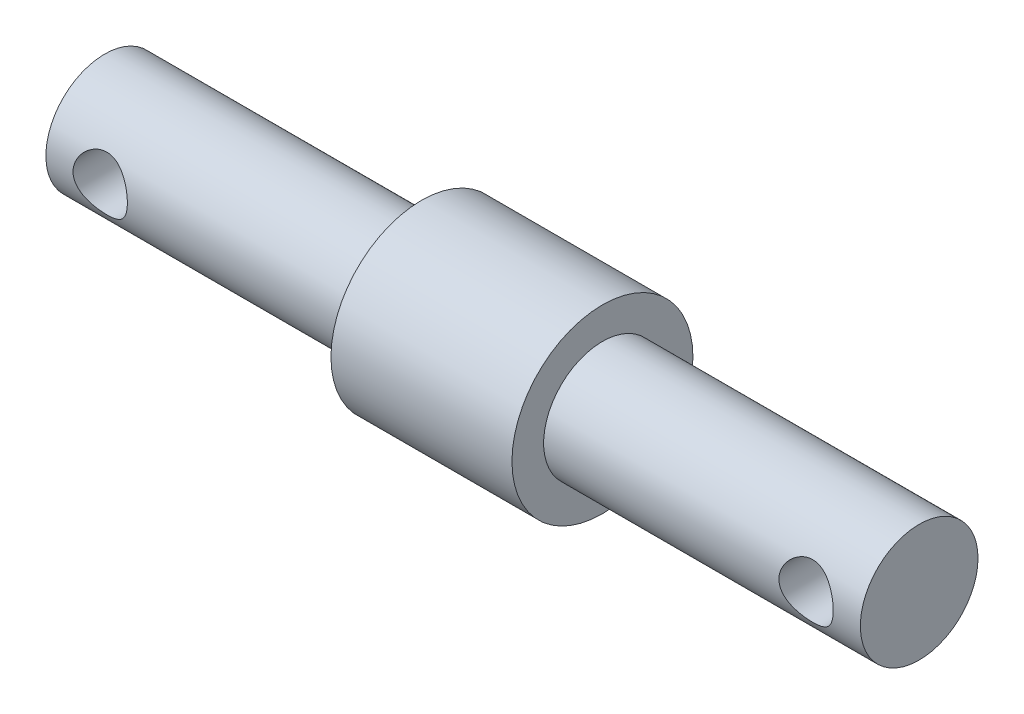
ISO-10303-21;
HEADER;
FILE_DESCRIPTION(('STEP AP214'),'2;1');
FILE_NAME('part.step','',(''),(''),'','','');
FILE_SCHEMA(('AUTOMOTIVE_DESIGN { 1 0 10303 214 1 1 1 1 }'));
ENDSEC;
DATA;
#1=APPLICATION_CONTEXT('core data for automotive mechanical design processes');
#2=APPLICATION_PROTOCOL_DEFINITION('international standard','automotive_design',2000,#1);
#3=PRODUCT_CONTEXT('',#1,'mechanical');
#4=PRODUCT('Part','Part','',(#3));
#5=PRODUCT_RELATED_PRODUCT_CATEGORY('part','',(#4));
#6=PRODUCT_DEFINITION_FORMATION('','',#4);
#7=PRODUCT_DEFINITION_CONTEXT('part definition',#1,'design');
#8=PRODUCT_DEFINITION('design','',#6,#7);
#9=PRODUCT_DEFINITION_SHAPE('','',#8);
#10=(LENGTH_UNIT() NAMED_UNIT(*) SI_UNIT(.MILLI.,.METRE.));
#11=(NAMED_UNIT(*) PLANE_ANGLE_UNIT() SI_UNIT($,.RADIAN.));
#12=(NAMED_UNIT(*) SI_UNIT($,.STERADIAN.) SOLID_ANGLE_UNIT());
#13=UNCERTAINTY_MEASURE_WITH_UNIT(LENGTH_MEASURE(1.E-05),#10,'distance_accuracy_value','');
#14=(GEOMETRIC_REPRESENTATION_CONTEXT(3) GLOBAL_UNCERTAINTY_ASSIGNED_CONTEXT((#13)) GLOBAL_UNIT_ASSIGNED_CONTEXT((#10,
#11,#12)) REPRESENTATION_CONTEXT('',''));
#15=CARTESIAN_POINT('',(0.,0.,0.));
#16=DIRECTION('',(0.,0.,1.));
#17=DIRECTION('',(1.,0.,0.));
#18=AXIS2_PLACEMENT_3D('',#15,#16,#17);
#19=CARTESIAN_POINT('',(22.5,0.,0.));
#20=DIRECTION('',(-1.,0.,0.));
#21=DIRECTION('',(0.,0.,1.));
#22=AXIS2_PLACEMENT_3D('',#19,#20,#21);
#23=CYLINDRICAL_SURFACE('',#22,3.25);
#24=CARTESIAN_POINT('',(5.,0.,0.));
#25=DIRECTION('',(1.,0.,0.));
#26=DIRECTION('',(0.,0.,-1.));
#27=AXIS2_PLACEMENT_3D('',#24,#25,#26);
#28=CIRCLE('',#27,3.25);
#29=CARTESIAN_POINT('',(5.,0.,-3.25));
#30=VERTEX_POINT('',#29);
#31=EDGE_CURVE('E35',#30,#30,#28,.T.);
#32=ORIENTED_EDGE('',*,*,#31,.T.);
#33=EDGE_LOOP('',(#32));
#34=FACE_BOUND('',#33,.T.);
#35=CARTESIAN_POINT('',(21.,0.,3.25));
#36=CARTESIAN_POINT('',(20.999995787521,-0.07956653360204,3.24999648247277));
#37=CARTESIAN_POINT('',(20.9936318652864,-0.159248802751997,3.24704578523041));
#38=CARTESIAN_POINT('',(20.9684368188157,-0.316302676462146,3.23553478985971));
#39=CARTESIAN_POINT('',(20.9495775159126,-0.393668644355887,3.22696181322454));
#40=CARTESIAN_POINT('',(20.9002613390825,-0.543571236651893,3.2051126172015));
#41=CARTESIAN_POINT('',(20.869847053397,-0.616124459577144,3.19185368124057));
#42=CARTESIAN_POINT('',(20.7984831664503,-0.755011505863265,3.16188428643623));
#43=CARTESIAN_POINT('',(20.7575354778342,-0.821346455351667,3.14517445431165));
#44=CARTESIAN_POINT('',(20.6637412957995,-0.949934488652826,3.10883035500973));
#45=CARTESIAN_POINT('',(20.6103730891206,-1.01177584846844,3.08908710707928));
#46=CARTESIAN_POINT('',(20.4943643723519,-1.12599874800721,3.04931006025544));
#47=CARTESIAN_POINT('',(20.4317179424784,-1.17837420047775,3.02927608328388));
#48=CARTESIAN_POINT('',(20.2941390566843,-1.27548887178323,2.98974101022941));
#49=CARTESIAN_POINT('',(20.2186793017865,-1.31953284801044,2.97035435123641));
#50=CARTESIAN_POINT('',(20.0604132530109,-1.39412192936299,2.93608939546151));
#51=CARTESIAN_POINT('',(19.9776115966009,-1.42467548371612,2.92120827864052));
#52=CARTESIAN_POINT('',(19.8117245268469,-1.46962454078475,2.89884571395906));
#53=CARTESIAN_POINT('',(19.7289063804143,-1.4848179245708,2.8910015734653));
#54=CARTESIAN_POINT('',(19.5615542706928,-1.50108773838038,2.88259066686592));
#55=CARTESIAN_POINT('',(19.4770216459131,-1.50217478633585,2.88201842715938));
#56=CARTESIAN_POINT('',(19.3175256844061,-1.49079280088205,2.88791642352155));
#57=CARTESIAN_POINT('',(19.2424372111908,-1.47964335102251,2.89370119933259));
#58=CARTESIAN_POINT('',(19.0953488838788,-1.44635609280636,2.91048067828192));
#59=CARTESIAN_POINT('',(19.0233498037563,-1.42421554815286,2.92147667875396));
#60=CARTESIAN_POINT('',(18.8824957158733,-1.36913890476633,2.94769456359194));
#61=CARTESIAN_POINT('',(18.8137507726206,-1.33596673085205,2.96300763226557));
#62=CARTESIAN_POINT('',(18.6824992310562,-1.2599408085694,2.99612519429948));
#63=CARTESIAN_POINT('',(18.6199953559801,-1.21708286028503,3.01393076717331));
#64=CARTESIAN_POINT('',(18.4960295930866,-1.11759089744586,3.05231404472979));
#65=CARTESIAN_POINT('',(18.4353794713411,-1.05997849303938,3.07298560052006));
#66=CARTESIAN_POINT('',(18.3242944951355,-0.935250632841351,3.11321361515149));
#67=CARTESIAN_POINT('',(18.2738632217161,-0.868131859637575,3.13276968136724));
#68=CARTESIAN_POINT('',(18.1830680936934,-0.723348423753623,3.16938837780687));
#69=CARTESIAN_POINT('',(18.1431066922417,-0.645401966429365,3.18634309674009));
#70=CARTESIAN_POINT('',(18.0771606394507,-0.482909298354604,3.21497815103089));
#71=CARTESIAN_POINT('',(18.0511664844807,-0.398367620109636,3.22666207188811));
#72=CARTESIAN_POINT('',(18.0157584231729,-0.231801419726404,3.2427218040747));
#73=CARTESIAN_POINT('',(18.0052597924311,-0.150053680320639,3.24757449131577));
#74=CARTESIAN_POINT('',(17.997818935066,0.0141754579229643,3.25100513162603));
#75=CARTESIAN_POINT('',(18.0008716061922,0.0966565689646145,3.2495854463303));
#76=CARTESIAN_POINT('',(18.0197405086181,0.254447728851397,3.24092695083229));
#77=CARTESIAN_POINT('',(18.034731016318,0.329879815922768,3.23406471548409));
#78=CARTESIAN_POINT('',(18.0758259707681,0.47703968174818,3.21565473000496));
#79=CARTESIAN_POINT('',(18.1019317302237,0.548767021851263,3.20410642645937));
#80=CARTESIAN_POINT('',(18.1653176562795,0.689005049925914,3.17695345815228));
#81=CARTESIAN_POINT('',(18.2029174973217,0.757348407882684,3.1612347190555));
#82=CARTESIAN_POINT('',(18.2878753743237,0.886999363186378,3.12733589867659));
#83=CARTESIAN_POINT('',(18.3352376981244,0.948303850462286,3.10915473706587));
#84=CARTESIAN_POINT('',(18.4431170185809,1.0677160558966,3.07030240901949));
#85=CARTESIAN_POINT('',(18.5044158349319,1.12509321772053,3.04955167366765));
#86=CARTESIAN_POINT('',(18.6359711553179,1.22901796417977,3.00917431114152));
#87=CARTESIAN_POINT('',(18.706231646296,1.27556070251232,2.98954818996151));
#88=CARTESIAN_POINT('',(18.8565122225598,1.35774539209928,2.95315331683977));
#89=CARTESIAN_POINT('',(18.9367631918531,1.39301513194685,2.93648892202038));
#90=CARTESIAN_POINT('',(19.1030877230937,1.44918714325353,2.90918351058036));
#91=CARTESIAN_POINT('',(19.1891549041169,1.47010488786372,2.89853600922792));
#92=CARTESIAN_POINT('',(19.3564321692355,1.49529060984287,2.88561745322169));
#93=CARTESIAN_POINT('',(19.4373929418536,1.50087454782971,2.8826853235251));
#94=CARTESIAN_POINT('',(19.5990993783273,1.49890349615771,2.88371144444688));
#95=CARTESIAN_POINT('',(19.679845093214,1.49135196602765,2.88766788080262));
#96=CARTESIAN_POINT('',(19.8329450912279,1.4645026372222,2.90136714358001));
#97=CARTESIAN_POINT('',(19.9054916725594,1.44606164108053,2.91068674382725));
#98=CARTESIAN_POINT('',(20.0464331262932,1.39890570133608,2.93364049026732));
#99=CARTESIAN_POINT('',(20.1148267647851,1.37018772156748,2.94727591136076));
#100=CARTESIAN_POINT('',(20.2504660004962,1.30114142777073,2.97843128061352));
#101=CARTESIAN_POINT('',(20.3173395867084,1.26017322224185,2.99614786625049));
#102=CARTESIAN_POINT('',(20.4436688753762,1.16858143831046,3.0330436879651));
#103=CARTESIAN_POINT('',(20.5031211723353,1.11795345395621,3.05222358907507));
#104=CARTESIAN_POINT('',(20.6189084266444,1.00267081983323,3.09212207628571));
#105=CARTESIAN_POINT('',(20.6743773440259,0.937130722089635,3.1128088140642));
#106=CARTESIAN_POINT('',(20.7736519598549,0.796983612052285,3.15160236946607));
#107=CARTESIAN_POINT('',(20.8174521789542,0.722372364022922,3.16970797320059));
#108=CARTESIAN_POINT('',(20.8915937351064,0.566452903867861,3.2012362062055));
#109=CARTESIAN_POINT('',(20.9220254800127,0.485194228853801,3.21469015731665));
#110=CARTESIAN_POINT('',(20.968442221957,0.318047129151278,3.23548841356123));
#111=CARTESIAN_POINT('',(20.9844704732234,0.23217339245485,3.24285100595264));
#112=CARTESIAN_POINT('',(20.9952796609948,0.121381352624895,3.24782399252521));
#113=CARTESIAN_POINT('',(20.9970479318607,0.0971493876498633,3.24863841958619));
#114=CARTESIAN_POINT('',(20.9994087555787,0.0486152181100412,3.24972696562435));
#115=CARTESIAN_POINT('',(21.0000012872002,0.0243130122848319,3.2500010748449));
#116=CARTESIAN_POINT('',(21.,0.,3.25));
#117=B_SPLINE_CURVE_WITH_KNOTS('',3,(#35,#36,#37,#38,#39,#40,#41,#42,#43,#44,#45,#46,#47,#48,
#49,#50,#51,#52,#53,#54,#55,#56,#57,#58,#59,#60,#61,#62,#63,#64,#65,#66,#67,#68,#69,#70,#71,#72,
#73,#74,#75,#76,#77,#78,#79,#80,#81,#82,#83,#84,#85,#86,#87,#88,#89,#90,#91,#92,#93,#94,#95,#96,
#97,#98,#99,#100,#101,#102,#103,#104,#105,#106,#107,#108,#109,#110,#111,#112,#113,#114,#115,
#116),.UNSPECIFIED.,.T.,.F.,(4,2,2,2,2,2,2,2,2,2,2,2,2,2,2,2,2,2,2,2,2,2,2,2,2,2,2,2,2,2,2,2,2,
2,2,2,2,2,2,2,4),(0.,0.238600102483911,0.477740118245302,0.716007153654802,0.954230955270992,
1.20527368348811,1.45647728005177,1.72361737244145,1.99058991333629,2.24284530975915,
2.49491082085964,2.72224505371487,2.94963591115234,3.18224489338959,3.41495493301191,
3.67231630672517,3.92976771345169,4.19600797435801,4.46206684922304,4.70843465098172,
4.95470969975967,5.18529144757862,5.41590043453885,5.65361863134684,5.8914414611822,
6.14975555625562,6.4081849756982,6.6744294938156,6.94038651584684,7.18267705005867,
7.42490378112663,7.65022078469501,7.87560440949579,8.11582604918683,8.3561575201829,
8.61987112719259,8.88370835055027,9.14573275427444,9.40696763362011,9.47987495044763,
9.5527835837666),.UNSPECIFIED.);
#118=CARTESIAN_POINT('',(21.,0.,3.25));
#119=VERTEX_POINT('',#118);
#120=EDGE_CURVE('E46',#119,#119,#117,.T.);
#121=ORIENTED_EDGE('',*,*,#120,.T.);
#122=EDGE_LOOP('',(#121));
#123=FACE_BOUND('',#122,.T.);
#124=CARTESIAN_POINT('',(21.,0.,-3.25));
#125=CARTESIAN_POINT('',(20.999995787521,0.0795665336020402,-3.24999648247277));
#126=CARTESIAN_POINT('',(20.9936318652864,0.159248802751997,-3.24704578523041));
#127=CARTESIAN_POINT('',(20.9684368188157,0.316302676462146,-3.23553478985971));
#128=CARTESIAN_POINT('',(20.9495775159126,0.393668644355888,-3.22696181322454));
#129=CARTESIAN_POINT('',(20.9002613390825,0.543571236651893,-3.2051126172015));
#130=CARTESIAN_POINT('',(20.869847053397,0.616124459577144,-3.19185368124057));
#131=CARTESIAN_POINT('',(20.7984831664503,0.755011505863265,-3.16188428643623));
#132=CARTESIAN_POINT('',(20.7575354778342,0.821346455351667,-3.14517445431165));
#133=CARTESIAN_POINT('',(20.6637412957995,0.949934488652826,-3.10883035500973));
#134=CARTESIAN_POINT('',(20.6103730891206,1.01177584846844,-3.08908710707928));
#135=CARTESIAN_POINT('',(20.4943643723519,1.12599874800721,-3.04931006025544));
#136=CARTESIAN_POINT('',(20.4317179424784,1.17837420047775,-3.02927608328388));
#137=CARTESIAN_POINT('',(20.2941390566843,1.27548887178323,-2.98974101022941));
#138=CARTESIAN_POINT('',(20.2186793017865,1.31953284801044,-2.97035435123641));
#139=CARTESIAN_POINT('',(20.0604132530109,1.39412192936299,-2.93608939546151));
#140=CARTESIAN_POINT('',(19.9776115966009,1.42467548371612,-2.92120827864052));
#141=CARTESIAN_POINT('',(19.8117245268469,1.46962454078475,-2.89884571395906));
#142=CARTESIAN_POINT('',(19.7289063804143,1.4848179245708,-2.8910015734653));
#143=CARTESIAN_POINT('',(19.5615542706928,1.50108773838038,-2.88259066686592));
#144=CARTESIAN_POINT('',(19.4770216459131,1.50217478633585,-2.88201842715938));
#145=CARTESIAN_POINT('',(19.3175256844061,1.49079280088205,-2.88791642352155));
#146=CARTESIAN_POINT('',(19.2424372111908,1.47964335102251,-2.89370119933259));
#147=CARTESIAN_POINT('',(19.0953488838788,1.44635609280636,-2.91048067828192));
#148=CARTESIAN_POINT('',(19.0233498037563,1.42421554815286,-2.92147667875396));
#149=CARTESIAN_POINT('',(18.8824957158733,1.36913890476633,-2.94769456359194));
#150=CARTESIAN_POINT('',(18.8137507726206,1.33596673085205,-2.96300763226557));
#151=CARTESIAN_POINT('',(18.6824992310562,1.2599408085694,-2.99612519429948));
#152=CARTESIAN_POINT('',(18.6199953559801,1.21708286028503,-3.01393076717331));
#153=CARTESIAN_POINT('',(18.4960295930866,1.11759089744586,-3.05231404472979));
#154=CARTESIAN_POINT('',(18.4353794713411,1.05997849303938,-3.07298560052006));
#155=CARTESIAN_POINT('',(18.3242944951355,0.935250632841351,-3.11321361515149));
#156=CARTESIAN_POINT('',(18.2738632217161,0.868131859637575,-3.13276968136724));
#157=CARTESIAN_POINT('',(18.1830680936934,0.723348423753623,-3.16938837780687));
#158=CARTESIAN_POINT('',(18.1431066922417,0.645401966429365,-3.18634309674009));
#159=CARTESIAN_POINT('',(18.0771606394507,0.482909298354605,-3.21497815103089));
#160=CARTESIAN_POINT('',(18.0511664844807,0.398367620109636,-3.22666207188811));
#161=CARTESIAN_POINT('',(18.0157584231729,0.231801419726403,-3.2427218040747));
#162=CARTESIAN_POINT('',(18.0052597924311,0.150053680320639,-3.24757449131577));
#163=CARTESIAN_POINT('',(17.997818935066,-0.0141754579229643,-3.25100513162603));
#164=CARTESIAN_POINT('',(18.0008716061922,-0.0966565689646146,-3.2495854463303));
#165=CARTESIAN_POINT('',(18.0197405086181,-0.254447728851396,-3.24092695083229));
#166=CARTESIAN_POINT('',(18.034731016318,-0.329879815922767,-3.23406471548409));
#167=CARTESIAN_POINT('',(18.0758259707681,-0.477039681748179,-3.21565473000496));
#168=CARTESIAN_POINT('',(18.1019317302237,-0.548767021851262,-3.20410642645937));
#169=CARTESIAN_POINT('',(18.1653176562795,-0.689005049925914,-3.17695345815228));
#170=CARTESIAN_POINT('',(18.2029174973217,-0.757348407882684,-3.1612347190555));
#171=CARTESIAN_POINT('',(18.2878753743237,-0.886999363186378,-3.12733589867659));
#172=CARTESIAN_POINT('',(18.3352376981244,-0.948303850462286,-3.10915473706587));
#173=CARTESIAN_POINT('',(18.4431170185809,-1.0677160558966,-3.07030240901949));
#174=CARTESIAN_POINT('',(18.5044158349319,-1.12509321772053,-3.04955167366765));
#175=CARTESIAN_POINT('',(18.6359711553179,-1.22901796417977,-3.00917431114152));
#176=CARTESIAN_POINT('',(18.706231646296,-1.27556070251232,-2.98954818996151));
#177=CARTESIAN_POINT('',(18.8565122225598,-1.35774539209928,-2.95315331683977));
#178=CARTESIAN_POINT('',(18.9367631918531,-1.39301513194685,-2.93648892202038));
#179=CARTESIAN_POINT('',(19.1030877230937,-1.44918714325353,-2.90918351058036));
#180=CARTESIAN_POINT('',(19.1891549041169,-1.47010488786372,-2.89853600922792));
#181=CARTESIAN_POINT('',(19.3564321692355,-1.49529060984287,-2.88561745322169));
#182=CARTESIAN_POINT('',(19.4373929418536,-1.50087454782971,-2.8826853235251));
#183=CARTESIAN_POINT('',(19.5990993783273,-1.49890349615771,-2.88371144444688));
#184=CARTESIAN_POINT('',(19.679845093214,-1.49135196602765,-2.88766788080262));
#185=CARTESIAN_POINT('',(19.8329450912279,-1.4645026372222,-2.90136714358001));
#186=CARTESIAN_POINT('',(19.9054916725593,-1.44606164108053,-2.91068674382725));
#187=CARTESIAN_POINT('',(20.0464331262932,-1.39890570133608,-2.93364049026732));
#188=CARTESIAN_POINT('',(20.1148267647851,-1.37018772156748,-2.94727591136076));
#189=CARTESIAN_POINT('',(20.2504660004962,-1.30114142777073,-2.97843128061352));
#190=CARTESIAN_POINT('',(20.3173395867084,-1.26017322224185,-2.99614786625049));
#191=CARTESIAN_POINT('',(20.4436688753762,-1.16858143831046,-3.0330436879651));
#192=CARTESIAN_POINT('',(20.5031211723353,-1.11795345395621,-3.05222358907507));
#193=CARTESIAN_POINT('',(20.6189084266444,-1.00267081983323,-3.09212207628571));
#194=CARTESIAN_POINT('',(20.6743773440259,-0.937130722089635,-3.1128088140642));
#195=CARTESIAN_POINT('',(20.7736519598549,-0.796983612052285,-3.15160236946607));
#196=CARTESIAN_POINT('',(20.8174521789542,-0.722372364022923,-3.16970797320059));
#197=CARTESIAN_POINT('',(20.8915937351064,-0.566452903867861,-3.2012362062055));
#198=CARTESIAN_POINT('',(20.9220254800127,-0.4851942288538,-3.21469015731665));
#199=CARTESIAN_POINT('',(20.968442221957,-0.318047129151278,-3.23548841356123));
#200=CARTESIAN_POINT('',(20.9844704732234,-0.23217339245485,-3.24285100595264));
#201=CARTESIAN_POINT('',(20.9952796609948,-0.121381352624895,-3.24782399252521));
#202=CARTESIAN_POINT('',(20.9970479318607,-0.0971493876498633,-3.24863841958619));
#203=CARTESIAN_POINT('',(20.9994087555787,-0.0486152181100412,-3.24972696562435));
#204=CARTESIAN_POINT('',(21.0000012872002,-0.0243130122848319,-3.2500010748449));
#205=CARTESIAN_POINT('',(21.,0.,-3.25));
#206=B_SPLINE_CURVE_WITH_KNOTS('',3,(#124,#125,#126,#127,#128,#129,#130,#131,#132,#133,#134,
#135,#136,#137,#138,#139,#140,#141,#142,#143,#144,#145,#146,#147,#148,#149,#150,#151,#152,#153,
#154,#155,#156,#157,#158,#159,#160,#161,#162,#163,#164,#165,#166,#167,#168,#169,#170,#171,#172,
#173,#174,#175,#176,#177,#178,#179,#180,#181,#182,#183,#184,#185,#186,#187,#188,#189,#190,#191,
#192,#193,#194,#195,#196,#197,#198,#199,#200,#201,#202,#203,#204,#205),.UNSPECIFIED.,.T.,.F.,(4,
2,2,2,2,2,2,2,2,2,2,2,2,2,2,2,2,2,2,2,2,2,2,2,2,2,2,2,2,2,2,2,2,2,2,2,2,2,2,2,4),(0.,
0.238600102483911,0.477740118245302,0.716007153654802,0.954230955270992,1.20527368348811,
1.45647728005177,1.72361737244145,1.99058991333629,2.24284530975915,2.49491082085964,
2.72224505371487,2.94963591115234,3.18224489338959,3.41495493301191,3.67231630672517,
3.92976771345169,4.19600797435801,4.46206684922304,4.70843465098172,4.95470969975967,
5.18529144757862,5.41590043453885,5.65361863134684,5.8914414611822,6.14975555625562,
6.4081849756982,6.67442949381559,6.94038651584684,7.18267705005867,7.42490378112663,
7.65022078469501,7.87560440949579,8.11582604918682,8.3561575201829,8.61987112719259,
8.88370835055027,9.14573275427444,9.40696763362011,9.47987495044763,9.5527835837666),.UNSPECIFIED.);
#207=CARTESIAN_POINT('',(21.,0.,-3.25));
#208=VERTEX_POINT('',#207);
#209=EDGE_CURVE('E53',#208,#208,#206,.T.);
#210=ORIENTED_EDGE('',*,*,#209,.T.);
#211=EDGE_LOOP('',(#210));
#212=FACE_BOUND('',#211,.T.);
#213=CARTESIAN_POINT('',(22.5,0.,0.));
#214=DIRECTION('',(1.,0.,0.));
#215=DIRECTION('',(0.,0.,-1.));
#216=AXIS2_PLACEMENT_3D('',#213,#214,#215);
#217=CIRCLE('',#216,3.25);
#218=CARTESIAN_POINT('',(22.5,0.,-3.25));
#219=VERTEX_POINT('',#218);
#220=EDGE_CURVE('E39',#219,#219,#217,.T.);
#221=ORIENTED_EDGE('',*,*,#220,.F.);
#222=EDGE_LOOP('',(#221));
#223=FACE_BOUND('',#222,.T.);
#224=ADVANCED_FACE('F31',(#34,#123,#212,#223),#23,.T.);
#225=CARTESIAN_POINT('',(22.5,0.,0.));
#226=DIRECTION('',(1.,0.,0.));
#227=DIRECTION('',(0.,0.,-1.));
#228=AXIS2_PLACEMENT_3D('',#225,#226,#227);
#229=PLANE('',#228);
#230=ORIENTED_EDGE('',*,*,#220,.T.);
#231=EDGE_LOOP('',(#230));
#232=FACE_BOUND('',#231,.T.);
#233=ADVANCED_FACE('F63',(#232),#229,.T.);
#234=CARTESIAN_POINT('',(19.5,0.,-15.));
#235=DIRECTION('',(0.,0.,1.));
#236=DIRECTION('',(1.,0.,0.));
#237=AXIS2_PLACEMENT_3D('',#234,#235,#236);
#238=CYLINDRICAL_SURFACE('',#237,1.5);
#239=ORIENTED_EDGE('',*,*,#209,.F.);
#240=EDGE_LOOP('',(#239));
#241=FACE_BOUND('',#240,.T.);
#242=ORIENTED_EDGE('',*,*,#120,.F.);
#243=EDGE_LOOP('',(#242));
#244=FACE_BOUND('',#243,.T.);
#245=ADVANCED_FACE('F57',(#241,#244),#238,.F.);
#246=CARTESIAN_POINT('',(5.,0.,0.));
#247=DIRECTION('',(1.,0.,0.));
#248=DIRECTION('',(0.,0.,-1.));
#249=AXIS2_PLACEMENT_3D('',#246,#247,#248);
#250=PLANE('',#249);
#251=CARTESIAN_POINT('',(5.,0.,0.));
#252=DIRECTION('',(1.,0.,0.));
#253=DIRECTION('',(0.,0.,-1.));
#254=AXIS2_PLACEMENT_3D('',#251,#252,#253);
#255=CIRCLE('',#254,5.);
#256=CARTESIAN_POINT('',(5.,0.,-5.));
#257=VERTEX_POINT('',#256);
#258=EDGE_CURVE('E116',#257,#257,#255,.T.);
#259=ORIENTED_EDGE('',*,*,#258,.T.);
#260=EDGE_LOOP('',(#259));
#261=FACE_BOUND('',#260,.T.);
#262=ORIENTED_EDGE('',*,*,#31,.F.);
#263=EDGE_LOOP('',(#262));
#264=FACE_BOUND('',#263,.T.);
#265=ADVANCED_FACE('F62',(#261,#264),#250,.T.);
#266=CARTESIAN_POINT('',(-5.,0.,0.));
#267=DIRECTION('',(1.,0.,0.));
#268=DIRECTION('',(0.,0.,-1.));
#269=AXIS2_PLACEMENT_3D('',#266,#267,#268);
#270=PLANE('',#269);
#271=CARTESIAN_POINT('',(-5.,0.,0.));
#272=DIRECTION('',(1.,0.,0.));
#273=DIRECTION('',(0.,0.,-1.));
#274=AXIS2_PLACEMENT_3D('',#271,#272,#273);
#275=CIRCLE('',#274,5.);
#276=CARTESIAN_POINT('',(-5.,0.,-5.));
#277=VERTEX_POINT('',#276);
#278=EDGE_CURVE('E118',#277,#277,#275,.T.);
#279=ORIENTED_EDGE('',*,*,#278,.F.);
#280=EDGE_LOOP('',(#279));
#281=FACE_BOUND('',#280,.T.);
#282=CARTESIAN_POINT('',(-5.,0.,0.));
#283=DIRECTION('',(1.,0.,0.));
#284=DIRECTION('',(0.,0.,-1.));
#285=AXIS2_PLACEMENT_3D('',#282,#283,#284);
#286=CIRCLE('',#285,3.25);
#287=CARTESIAN_POINT('',(-5.,0.,-3.25));
#288=VERTEX_POINT('',#287);
#289=EDGE_CURVE('E10',#288,#288,#286,.T.);
#290=ORIENTED_EDGE('',*,*,#289,.T.);
#291=EDGE_LOOP('',(#290));
#292=FACE_BOUND('',#291,.T.);
#293=ADVANCED_FACE('F127',(#281,#292),#270,.F.);
#294=CARTESIAN_POINT('',(5.,0.,0.));
#295=DIRECTION('',(-1.,0.,0.));
#296=DIRECTION('',(0.,0.,1.));
#297=AXIS2_PLACEMENT_3D('',#294,#295,#296);
#298=CYLINDRICAL_SURFACE('',#297,5.);
#299=ORIENTED_EDGE('',*,*,#258,.F.);
#300=EDGE_LOOP('',(#299));
#301=FACE_BOUND('',#300,.T.);
#302=ORIENTED_EDGE('',*,*,#278,.T.);
#303=EDGE_LOOP('',(#302));
#304=FACE_BOUND('',#303,.T.);
#305=ADVANCED_FACE('F65',(#301,#304),#298,.T.);
#306=CARTESIAN_POINT('',(-19.5,0.,-15.));
#307=DIRECTION('',(0.,0.,1.));
#308=DIRECTION('',(1.,0.,0.));
#309=AXIS2_PLACEMENT_3D('',#306,#307,#308);
#310=CYLINDRICAL_SURFACE('',#309,1.5);
#311=CARTESIAN_POINT('',(-18.,0.,-3.25));
#312=CARTESIAN_POINT('',(-18.000004212479,0.0795665336020402,-3.24999648247277));
#313=CARTESIAN_POINT('',(-18.0063681347136,0.159248802751997,-3.24704578523041));
#314=CARTESIAN_POINT('',(-18.0315631811843,0.316302676462146,-3.23553478985971));
#315=CARTESIAN_POINT('',(-18.0504224840874,0.393668644355887,-3.22696181322454));
#316=CARTESIAN_POINT('',(-18.0997386609175,0.543571236651893,-3.2051126172015));
#317=CARTESIAN_POINT('',(-18.130152946603,0.616124459577144,-3.19185368124057));
#318=CARTESIAN_POINT('',(-18.2015168335497,0.755011505863265,-3.16188428643623));
#319=CARTESIAN_POINT('',(-18.2424645221658,0.821346455351667,-3.14517445431165));
#320=CARTESIAN_POINT('',(-18.3362587042005,0.949934488652826,-3.10883035500973));
#321=CARTESIAN_POINT('',(-18.3896269108794,1.01177584846844,-3.08908710707928));
#322=CARTESIAN_POINT('',(-18.5056356276481,1.12599874800721,-3.04931006025544));
#323=CARTESIAN_POINT('',(-18.5682820575216,1.17837420047775,-3.02927608328388));
#324=CARTESIAN_POINT('',(-18.7058609433157,1.27548887178323,-2.98974101022941));
#325=CARTESIAN_POINT('',(-18.7813206982135,1.31953284801044,-2.97035435123641));
#326=CARTESIAN_POINT('',(-18.9395867469891,1.39412192936299,-2.93608939546151));
#327=CARTESIAN_POINT('',(-19.0223884033991,1.42467548371612,-2.92120827864052));
#328=CARTESIAN_POINT('',(-19.1882754731531,1.46962454078475,-2.89884571395906));
#329=CARTESIAN_POINT('',(-19.2710936195857,1.4848179245708,-2.8910015734653));
#330=CARTESIAN_POINT('',(-19.4384457293072,1.50108773838038,-2.88259066686592));
#331=CARTESIAN_POINT('',(-19.5229783540869,1.50217478633585,-2.88201842715938));
#332=CARTESIAN_POINT('',(-19.6824743155939,1.49079280088205,-2.88791642352155));
#333=CARTESIAN_POINT('',(-19.7575627888092,1.47964335102251,-2.89370119933259));
#334=CARTESIAN_POINT('',(-19.9046511161212,1.44635609280636,-2.91048067828192));
#335=CARTESIAN_POINT('',(-19.9766501962437,1.42421554815286,-2.92147667875396));
#336=CARTESIAN_POINT('',(-20.1175042841267,1.36913890476633,-2.94769456359194));
#337=CARTESIAN_POINT('',(-20.1862492273794,1.33596673085205,-2.96300763226557));
#338=CARTESIAN_POINT('',(-20.3175007689438,1.2599408085694,-2.99612519429948));
#339=CARTESIAN_POINT('',(-20.3800046440199,1.21708286028503,-3.01393076717331));
#340=CARTESIAN_POINT('',(-20.5039704069134,1.11759089744586,-3.05231404472979));
#341=CARTESIAN_POINT('',(-20.5646205286589,1.05997849303938,-3.07298560052006));
#342=CARTESIAN_POINT('',(-20.6757055048645,0.935250632841352,-3.11321361515149));
#343=CARTESIAN_POINT('',(-20.7261367782839,0.868131859637576,-3.13276968136724));
#344=CARTESIAN_POINT('',(-20.8169319063066,0.723348423753623,-3.16938837780687));
#345=CARTESIAN_POINT('',(-20.8568933077583,0.645401966429364,-3.18634309674009));
#346=CARTESIAN_POINT('',(-20.9228393605493,0.482909298354604,-3.21497815103089));
#347=CARTESIAN_POINT('',(-20.9488335155193,0.398367620109636,-3.22666207188811));
#348=CARTESIAN_POINT('',(-20.9842415768271,0.231801419726404,-3.2427218040747));
#349=CARTESIAN_POINT('',(-20.9947402075689,0.150053680320639,-3.24757449131577));
#350=CARTESIAN_POINT('',(-21.002181064934,-0.0141754579229644,-3.25100513162603));
#351=CARTESIAN_POINT('',(-20.9991283938078,-0.0966565689646146,-3.2495854463303));
#352=CARTESIAN_POINT('',(-20.9802594913819,-0.254447728851397,-3.24092695083229));
#353=CARTESIAN_POINT('',(-20.965268983682,-0.329879815922769,-3.23406471548409));
#354=CARTESIAN_POINT('',(-20.9241740292319,-0.477039681748181,-3.21565473000496));
#355=CARTESIAN_POINT('',(-20.8980682697763,-0.548767021851263,-3.20410642645936));
#356=CARTESIAN_POINT('',(-20.8346823437205,-0.689005049925914,-3.17695345815228));
#357=CARTESIAN_POINT('',(-20.7970825026783,-0.757348407882685,-3.1612347190555));
#358=CARTESIAN_POINT('',(-20.7121246256763,-0.88699936318638,-3.12733589867659));
#359=CARTESIAN_POINT('',(-20.6647623018756,-0.948303850462287,-3.10915473706587));
#360=CARTESIAN_POINT('',(-20.5568829814191,-1.0677160558966,-3.07030240901949));
#361=CARTESIAN_POINT('',(-20.4955841650681,-1.12509321772053,-3.04955167366765));
#362=CARTESIAN_POINT('',(-20.3640288446821,-1.22901796417977,-3.00917431114152));
#363=CARTESIAN_POINT('',(-20.293768353704,-1.27556070251232,-2.98954818996151));
#364=CARTESIAN_POINT('',(-20.1434877774402,-1.35774539209928,-2.95315331683977));
#365=CARTESIAN_POINT('',(-20.0632368081469,-1.39301513194685,-2.93648892202038));
#366=CARTESIAN_POINT('',(-19.8969122769063,-1.44918714325353,-2.90918351058036));
#367=CARTESIAN_POINT('',(-19.8108450958831,-1.47010488786372,-2.89853600922792));
#368=CARTESIAN_POINT('',(-19.6435678307645,-1.49529060984287,-2.88561745322169));
#369=CARTESIAN_POINT('',(-19.5626070581464,-1.50087454782971,-2.8826853235251));
#370=CARTESIAN_POINT('',(-19.4009006216727,-1.49890349615771,-2.88371144444688));
#371=CARTESIAN_POINT('',(-19.320154906786,-1.49135196602765,-2.88766788080262));
#372=CARTESIAN_POINT('',(-19.1670549087721,-1.4645026372222,-2.90136714358001));
#373=CARTESIAN_POINT('',(-19.0945083274406,-1.44606164108053,-2.91068674382725));
#374=CARTESIAN_POINT('',(-18.9535668737068,-1.39890570133608,-2.93364049026732));
#375=CARTESIAN_POINT('',(-18.8851732352149,-1.37018772156748,-2.94727591136076));
#376=CARTESIAN_POINT('',(-18.7495339995038,-1.30114142777073,-2.97843128061352));
#377=CARTESIAN_POINT('',(-18.6826604132916,-1.26017322224185,-2.99614786625049));
#378=CARTESIAN_POINT('',(-18.5563311246238,-1.16858143831046,-3.0330436879651));
#379=CARTESIAN_POINT('',(-18.4968788276647,-1.11795345395621,-3.05222358907507));
#380=CARTESIAN_POINT('',(-18.3810915733556,-1.00267081983323,-3.09212207628571));
#381=CARTESIAN_POINT('',(-18.3256226559741,-0.937130722089632,-3.1128088140642));
#382=CARTESIAN_POINT('',(-18.2263480401451,-0.796983612052282,-3.15160236946607));
#383=CARTESIAN_POINT('',(-18.1825478210458,-0.722372364022922,-3.16970797320059));
#384=CARTESIAN_POINT('',(-18.1084062648936,-0.566452903867861,-3.2012362062055));
#385=CARTESIAN_POINT('',(-18.0779745199873,-0.485194228853799,-3.21469015731665));
#386=CARTESIAN_POINT('',(-18.031557778043,-0.318047129151274,-3.23548841356123));
#387=CARTESIAN_POINT('',(-18.0155295267766,-0.232173392454846,-3.24285100595264));
#388=CARTESIAN_POINT('',(-18.0047203390052,-0.121381352624891,-3.24782399252521));
#389=CARTESIAN_POINT('',(-18.0029520681393,-0.0971493876498597,-3.24863841958619));
#390=CARTESIAN_POINT('',(-18.0005912444213,-0.0486152181100392,-3.24972696562435));
#391=CARTESIAN_POINT('',(-17.9999987127998,-0.0243130122848309,-3.2500010748449));
#392=CARTESIAN_POINT('',(-18.,0.,-3.25));
#393=B_SPLINE_CURVE_WITH_KNOTS('',3,(#311,#312,#313,#314,#315,#316,#317,#318,#319,#320,#321,
#322,#323,#324,#325,#326,#327,#328,#329,#330,#331,#332,#333,#334,#335,#336,#337,#338,#339,#340,
#341,#342,#343,#344,#345,#346,#347,#348,#349,#350,#351,#352,#353,#354,#355,#356,#357,#358,#359,
#360,#361,#362,#363,#364,#365,#366,#367,#368,#369,#370,#371,#372,#373,#374,#375,#376,#377,#378,
#379,#380,#381,#382,#383,#384,#385,#386,#387,#388,#389,#390,#391,#392),.UNSPECIFIED.,.T.,.F.,(4,
2,2,2,2,2,2,2,2,2,2,2,2,2,2,2,2,2,2,2,2,2,2,2,2,2,2,2,2,2,2,2,2,2,2,2,2,2,2,2,4),(0.,
0.238600102483911,0.477740118245302,0.716007153654802,0.954230955270992,1.20527368348811,
1.45647728005177,1.72361737244145,1.99058991333629,2.24284530975915,2.49491082085964,
2.72224505371487,2.94963591115234,3.18224489338959,3.41495493301191,3.67231630672516,
3.92976771345169,4.19600797435801,4.46206684922304,4.70843465098172,4.95470969975967,
5.18529144757862,5.41590043453885,5.65361863134684,5.8914414611822,6.14975555625562,
6.4081849756982,6.67442949381559,6.94038651584683,7.18267705005867,7.42490378112662,
7.65022078469501,7.87560440949579,8.11582604918683,8.35615752018289,8.61987112719259,
8.88370835055026,9.14573275427444,9.40696763362011,9.47987495044762,9.5527835837666),.UNSPECIFIED.);
#394=CARTESIAN_POINT('',(-18.,0.,-3.25));
#395=VERTEX_POINT('',#394);
#396=EDGE_CURVE('E52',#395,#395,#393,.T.);
#397=ORIENTED_EDGE('',*,*,#396,.F.);
#398=EDGE_LOOP('',(#397));
#399=FACE_BOUND('',#398,.T.);
#400=CARTESIAN_POINT('',(-18.,0.,3.25));
#401=CARTESIAN_POINT('',(-18.000004212479,-0.0795665336020396,3.24999648247277));
#402=CARTESIAN_POINT('',(-18.0063681347136,-0.159248802751996,3.24704578523041));
#403=CARTESIAN_POINT('',(-18.0315631811843,-0.316302676462145,3.23553478985971));
#404=CARTESIAN_POINT('',(-18.0504224840874,-0.393668644355887,3.22696181322454));
#405=CARTESIAN_POINT('',(-18.0997386609175,-0.543571236651893,3.2051126172015));
#406=CARTESIAN_POINT('',(-18.130152946603,-0.616124459577144,3.19185368124057));
#407=CARTESIAN_POINT('',(-18.2015168335497,-0.755011505863265,3.16188428643623));
#408=CARTESIAN_POINT('',(-18.2424645221658,-0.821346455351667,3.14517445431165));
#409=CARTESIAN_POINT('',(-18.3362587042005,-0.949934488652826,3.10883035500973));
#410=CARTESIAN_POINT('',(-18.3896269108794,-1.01177584846844,3.08908710707928));
#411=CARTESIAN_POINT('',(-18.5056356276481,-1.12599874800721,3.04931006025544));
#412=CARTESIAN_POINT('',(-18.5682820575216,-1.17837420047775,3.02927608328388));
#413=CARTESIAN_POINT('',(-18.7058609433157,-1.27548887178323,2.98974101022941));
#414=CARTESIAN_POINT('',(-18.7813206982135,-1.31953284801044,2.97035435123641));
#415=CARTESIAN_POINT('',(-18.9395867469891,-1.39412192936299,2.93608939546151));
#416=CARTESIAN_POINT('',(-19.0223884033991,-1.42467548371612,2.92120827864052));
#417=CARTESIAN_POINT('',(-19.1882754731531,-1.46962454078475,2.89884571395906));
#418=CARTESIAN_POINT('',(-19.2710936195857,-1.4848179245708,2.8910015734653));
#419=CARTESIAN_POINT('',(-19.4384457293072,-1.50108773838038,2.88259066686592));
#420=CARTESIAN_POINT('',(-19.5229783540869,-1.50217478633585,2.88201842715938));
#421=CARTESIAN_POINT('',(-19.6824743155939,-1.49079280088205,2.88791642352155));
#422=CARTESIAN_POINT('',(-19.7575627888092,-1.47964335102251,2.89370119933259));
#423=CARTESIAN_POINT('',(-19.9046511161212,-1.44635609280636,2.91048067828192));
#424=CARTESIAN_POINT('',(-19.9766501962437,-1.42421554815286,2.92147667875396));
#425=CARTESIAN_POINT('',(-20.1175042841267,-1.36913890476633,2.94769456359194));
#426=CARTESIAN_POINT('',(-20.1862492273794,-1.33596673085205,2.96300763226557));
#427=CARTESIAN_POINT('',(-20.3175007689438,-1.2599408085694,2.99612519429948));
#428=CARTESIAN_POINT('',(-20.3800046440199,-1.21708286028503,3.01393076717331));
#429=CARTESIAN_POINT('',(-20.5039704069134,-1.11759089744586,3.05231404472979));
#430=CARTESIAN_POINT('',(-20.5646205286589,-1.05997849303938,3.07298560052006));
#431=CARTESIAN_POINT('',(-20.6757055048645,-0.935250632841352,3.11321361515149));
#432=CARTESIAN_POINT('',(-20.7261367782839,-0.868131859637576,3.13276968136724));
#433=CARTESIAN_POINT('',(-20.8169319063066,-0.723348423753623,3.16938837780687));
#434=CARTESIAN_POINT('',(-20.8568933077583,-0.645401966429364,3.18634309674009));
#435=CARTESIAN_POINT('',(-20.9228393605493,-0.482909298354604,3.21497815103089));
#436=CARTESIAN_POINT('',(-20.9488335155193,-0.398367620109636,3.22666207188811));
#437=CARTESIAN_POINT('',(-20.9842415768271,-0.231801419726403,3.2427218040747));
#438=CARTESIAN_POINT('',(-20.9947402075689,-0.150053680320639,3.24757449131577));
#439=CARTESIAN_POINT('',(-21.002181064934,0.0141754579229646,3.25100513162603));
#440=CARTESIAN_POINT('',(-20.9991283938078,0.0966565689646147,3.2495854463303));
#441=CARTESIAN_POINT('',(-20.9802594913819,0.254447728851397,3.24092695083229));
#442=CARTESIAN_POINT('',(-20.965268983682,0.329879815922769,3.23406471548409));
#443=CARTESIAN_POINT('',(-20.9241740292319,0.477039681748181,3.21565473000496));
#444=CARTESIAN_POINT('',(-20.8980682697763,0.548767021851263,3.20410642645936));
#445=CARTESIAN_POINT('',(-20.8346823437205,0.689005049925915,3.17695345815228));
#446=CARTESIAN_POINT('',(-20.7970825026783,0.757348407882685,3.1612347190555));
#447=CARTESIAN_POINT('',(-20.7121246256763,0.88699936318638,3.12733589867659));
#448=CARTESIAN_POINT('',(-20.6647623018756,0.948303850462287,3.10915473706587));
#449=CARTESIAN_POINT('',(-20.5568829814191,1.0677160558966,3.07030240901949));
#450=CARTESIAN_POINT('',(-20.4955841650681,1.12509321772053,3.04955167366765));
#451=CARTESIAN_POINT('',(-20.3640288446821,1.22901796417977,3.00917431114152));
#452=CARTESIAN_POINT('',(-20.293768353704,1.27556070251232,2.98954818996151));
#453=CARTESIAN_POINT('',(-20.1434877774402,1.35774539209928,2.95315331683977));
#454=CARTESIAN_POINT('',(-20.0632368081469,1.39301513194685,2.93648892202038));
#455=CARTESIAN_POINT('',(-19.8969122769063,1.44918714325353,2.90918351058036));
#456=CARTESIAN_POINT('',(-19.8108450958831,1.47010488786372,2.89853600922792));
#457=CARTESIAN_POINT('',(-19.6435678307645,1.49529060984287,2.88561745322169));
#458=CARTESIAN_POINT('',(-19.5626070581464,1.50087454782971,2.8826853235251));
#459=CARTESIAN_POINT('',(-19.4009006216727,1.49890349615771,2.88371144444688));
#460=CARTESIAN_POINT('',(-19.320154906786,1.49135196602765,2.88766788080262));
#461=CARTESIAN_POINT('',(-19.1670549087721,1.4645026372222,2.90136714358001));
#462=CARTESIAN_POINT('',(-19.0945083274406,1.44606164108053,2.91068674382725));
#463=CARTESIAN_POINT('',(-18.9535668737068,1.39890570133608,2.93364049026732));
#464=CARTESIAN_POINT('',(-18.8851732352149,1.37018772156748,2.94727591136076));
#465=CARTESIAN_POINT('',(-18.7495339995038,1.30114142777073,2.97843128061352));
#466=CARTESIAN_POINT('',(-18.6826604132916,1.26017322224185,2.99614786625049));
#467=CARTESIAN_POINT('',(-18.5563311246238,1.16858143831046,3.0330436879651));
#468=CARTESIAN_POINT('',(-18.4968788276647,1.11795345395621,3.05222358907507));
#469=CARTESIAN_POINT('',(-18.3810915733556,1.00267081983323,3.09212207628571));
#470=CARTESIAN_POINT('',(-18.3256226559741,0.937130722089634,3.1128088140642));
#471=CARTESIAN_POINT('',(-18.2263480401451,0.796983612052284,3.15160236946607));
#472=CARTESIAN_POINT('',(-18.1825478210458,0.722372364022923,3.16970797320059));
#473=CARTESIAN_POINT('',(-18.1084062648936,0.566452903867861,3.2012362062055));
#474=CARTESIAN_POINT('',(-18.0779745199873,0.485194228853799,3.21469015731665));
#475=CARTESIAN_POINT('',(-18.031557778043,0.318047129151274,3.23548841356123));
#476=CARTESIAN_POINT('',(-18.0155295267766,0.232173392454846,3.24285100595264));
#477=CARTESIAN_POINT('',(-18.0047203390052,0.121381352624891,3.24782399252521));
#478=CARTESIAN_POINT('',(-18.0029520681393,0.09714938764986,3.24863841958619));
#479=CARTESIAN_POINT('',(-18.0005912444213,0.0486152181100396,3.24972696562435));
#480=CARTESIAN_POINT('',(-17.9999987127998,0.0243130122848311,3.2500010748449));
#481=CARTESIAN_POINT('',(-18.,0.,3.25));
#482=B_SPLINE_CURVE_WITH_KNOTS('',3,(#400,#401,#402,#403,#404,#405,#406,#407,#408,#409,#410,
#411,#412,#413,#414,#415,#416,#417,#418,#419,#420,#421,#422,#423,#424,#425,#426,#427,#428,#429,
#430,#431,#432,#433,#434,#435,#436,#437,#438,#439,#440,#441,#442,#443,#444,#445,#446,#447,#448,
#449,#450,#451,#452,#453,#454,#455,#456,#457,#458,#459,#460,#461,#462,#463,#464,#465,#466,#467,
#468,#469,#470,#471,#472,#473,#474,#475,#476,#477,#478,#479,#480,#481),.UNSPECIFIED.,.T.,.F.,(4,
2,2,2,2,2,2,2,2,2,2,2,2,2,2,2,2,2,2,2,2,2,2,2,2,2,2,2,2,2,2,2,2,2,2,2,2,2,2,2,4),(0.,
0.238600102483911,0.477740118245303,0.716007153654803,0.954230955270993,1.20527368348811,
1.45647728005178,1.72361737244145,1.99058991333629,2.24284530975915,2.49491082085964,
2.72224505371487,2.94963591115234,3.18224489338959,3.41495493301191,3.67231630672516,
3.92976771345169,4.19600797435801,4.46206684922304,4.70843465098172,4.95470969975967,
5.18529144757862,5.41590043453885,5.65361863134684,5.8914414611822,6.14975555625562,
6.4081849756982,6.67442949381559,6.94038651584683,7.18267705005867,7.42490378112662,
7.65022078469501,7.87560440949579,8.11582604918683,8.35615752018289,8.61987112719258,
8.88370835055027,9.14573275427444,9.40696763362011,9.47987495044762,9.5527835837666),.UNSPECIFIED.);
#483=CARTESIAN_POINT('',(-18.,0.,3.25));
#484=VERTEX_POINT('',#483);
#485=EDGE_CURVE('E79',#484,#484,#482,.T.);
#486=ORIENTED_EDGE('',*,*,#485,.F.);
#487=EDGE_LOOP('',(#486));
#488=FACE_BOUND('',#487,.T.);
#489=ADVANCED_FACE('F67',(#399,#488),#310,.F.);
#490=CARTESIAN_POINT('',(-22.5,0.,0.));
#491=DIRECTION('',(1.,0.,0.));
#492=DIRECTION('',(0.,0.,-1.));
#493=AXIS2_PLACEMENT_3D('',#490,#491,#492);
#494=PLANE('',#493);
#495=CARTESIAN_POINT('',(-22.5,0.,0.));
#496=DIRECTION('',(1.,0.,0.));
#497=DIRECTION('',(0.,0.,-1.));
#498=AXIS2_PLACEMENT_3D('',#495,#496,#497);
#499=CIRCLE('',#498,3.25);
#500=CARTESIAN_POINT('',(-22.5,0.,-3.25));
#501=VERTEX_POINT('',#500);
#502=EDGE_CURVE('E43',#501,#501,#499,.T.);
#503=ORIENTED_EDGE('',*,*,#502,.F.);
#504=EDGE_LOOP('',(#503));
#505=FACE_BOUND('',#504,.T.);
#506=ADVANCED_FACE('F72',(#505),#494,.F.);
#507=ORIENTED_EDGE('',*,*,#502,.T.);
#508=EDGE_LOOP('',(#507));
#509=FACE_BOUND('',#508,.T.);
#510=ORIENTED_EDGE('',*,*,#396,.T.);
#511=EDGE_LOOP('',(#510));
#512=FACE_BOUND('',#511,.T.);
#513=ORIENTED_EDGE('',*,*,#485,.T.);
#514=EDGE_LOOP('',(#513));
#515=FACE_BOUND('',#514,.T.);
#516=ORIENTED_EDGE('',*,*,#289,.F.);
#517=EDGE_LOOP('',(#516));
#518=FACE_BOUND('',#517,.T.);
#519=ADVANCED_FACE('F89',(#509,#512,#515,#518),#23,.T.);
#520=CLOSED_SHELL('',(#224,#233,#245,#265,#293,#305,#489,#506,#519));
#521=MANIFOLD_SOLID_BREP('B2',#520);
#522=ADVANCED_BREP_SHAPE_REPRESENTATION('',(#18,#521),#14);
#523=SHAPE_DEFINITION_REPRESENTATION(#9,#522);
ENDSEC;
END-ISO-10303-21;
